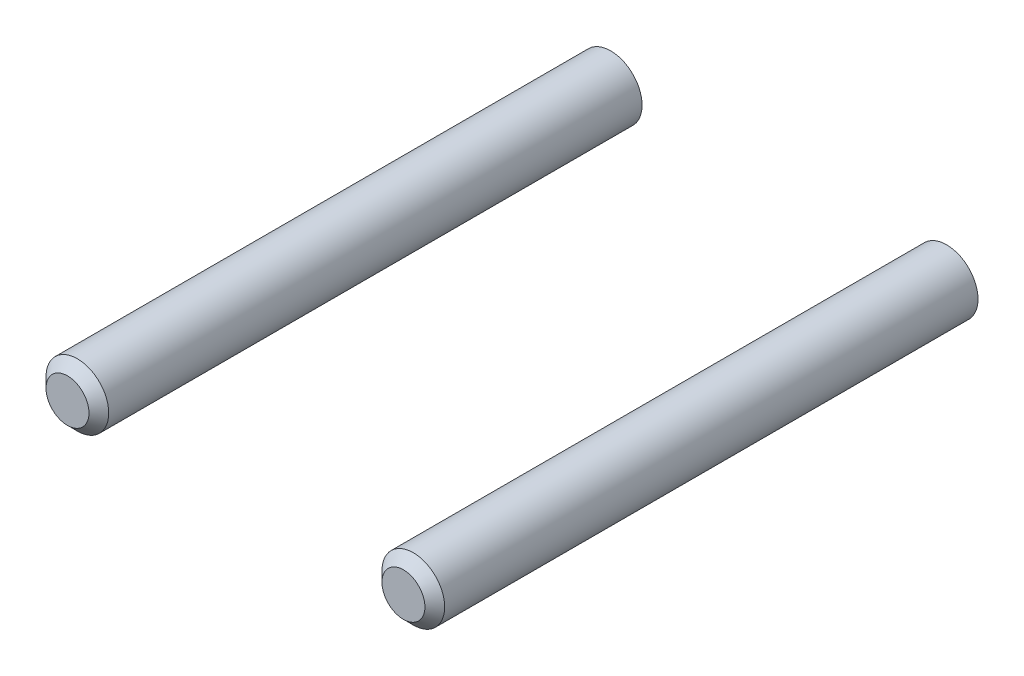
ISO-10303-21;
HEADER;
FILE_DESCRIPTION(('STEP AP214'),'2;1');
FILE_NAME('part.step','',(''),(''),'','','');
FILE_SCHEMA(('AUTOMOTIVE_DESIGN { 1 0 10303 214 1 1 1 1 }'));
ENDSEC;
DATA;
#1=APPLICATION_CONTEXT('core data for automotive mechanical design processes');
#2=APPLICATION_PROTOCOL_DEFINITION('international standard','automotive_design',2000,#1);
#3=PRODUCT_CONTEXT('',#1,'mechanical');
#4=PRODUCT('Part','Part','',(#3));
#5=PRODUCT_RELATED_PRODUCT_CATEGORY('part','',(#4));
#6=PRODUCT_DEFINITION_FORMATION('','',#4);
#7=PRODUCT_DEFINITION_CONTEXT('part definition',#1,'design');
#8=PRODUCT_DEFINITION('design','',#6,#7);
#9=PRODUCT_DEFINITION_SHAPE('','',#8);
#10=(LENGTH_UNIT() NAMED_UNIT(*) SI_UNIT(.MILLI.,.METRE.));
#11=(NAMED_UNIT(*) PLANE_ANGLE_UNIT() SI_UNIT($,.RADIAN.));
#12=(NAMED_UNIT(*) SI_UNIT($,.STERADIAN.) SOLID_ANGLE_UNIT());
#13=UNCERTAINTY_MEASURE_WITH_UNIT(LENGTH_MEASURE(1.E-05),#10,'distance_accuracy_value','');
#14=(GEOMETRIC_REPRESENTATION_CONTEXT(3) GLOBAL_UNCERTAINTY_ASSIGNED_CONTEXT((#13)) GLOBAL_UNIT_ASSIGNED_CONTEXT((#10,
#11,#12)) REPRESENTATION_CONTEXT('',''));
#15=CARTESIAN_POINT('',(0.,0.,0.));
#16=DIRECTION('',(0.,0.,1.));
#17=DIRECTION('',(1.,0.,0.));
#18=AXIS2_PLACEMENT_3D('',#15,#16,#17);
#19=CARTESIAN_POINT('',(36.5229699907981,36.9033953158821,-90.));
#20=DIRECTION('',(0.,0.,1.));
#21=DIRECTION('',(1.,0.,0.));
#22=AXIS2_PLACEMENT_3D('',#19,#20,#21);
#23=CYLINDRICAL_SURFACE('',#22,6.35);
#24=CARTESIAN_POINT('',(36.5229699907981,36.9033953158821,18.));
#25=DIRECTION('',(0.,0.,1.));
#26=DIRECTION('',(1.,0.,0.));
#27=AXIS2_PLACEMENT_3D('',#24,#25,#26);
#28=CIRCLE('',#27,6.35);
#29=CARTESIAN_POINT('',(42.8729699907981,36.9033953158821,18.));
#30=VERTEX_POINT('',#29);
#31=EDGE_CURVE('E11',#30,#30,#28,.F.);
#32=CARTESIAN_POINT('',(36.5229699907981,36.9033953158821,-90.));
#33=DIRECTION('',(0.,0.,1.));
#34=DIRECTION('',(1.,0.,0.));
#35=AXIS2_PLACEMENT_3D('',#32,#33,#34);
#36=CIRCLE('',#35,6.35);
#37=CARTESIAN_POINT('',(42.8729699907981,36.9033953158821,-90.));
#38=VERTEX_POINT('',#37);
#39=EDGE_CURVE('E50',#38,#38,#36,.T.);
#40=CARTESIAN_POINT('',(42.8729699907981,36.9033953158821,18.));
#41=CARTESIAN_POINT('',(42.8729699907981,36.9033953158821,16.875));
#42=CARTESIAN_POINT('',(42.8729699907981,36.9033953158821,15.75));
#43=CARTESIAN_POINT('',(42.8729699907981,36.9033953158821,13.5));
#44=CARTESIAN_POINT('',(42.8729699907981,36.9033953158821,12.375));
#45=CARTESIAN_POINT('',(42.8729699907981,36.9033953158821,10.125));
#46=CARTESIAN_POINT('',(42.8729699907981,36.9033953158821,9.00000000000002));
#47=CARTESIAN_POINT('',(42.8729699907981,36.9033953158821,6.75000000000002));
#48=CARTESIAN_POINT('',(42.8729699907981,36.9033953158821,5.62500000000002));
#49=CARTESIAN_POINT('',(42.8729699907981,36.9033953158821,3.37500000000002));
#50=CARTESIAN_POINT('',(42.8729699907981,36.9033953158821,2.25000000000003));
#51=CARTESIAN_POINT('',(42.8729699907981,36.9033953158821,0.));
#52=CARTESIAN_POINT('',(42.8729699907981,36.9033953158821,-1.12499999999998));
#53=CARTESIAN_POINT('',(42.8729699907981,36.9033953158821,-3.37499999999998));
#54=CARTESIAN_POINT('',(42.8729699907981,36.9033953158821,-4.49999999999998));
#55=CARTESIAN_POINT('',(42.8729699907981,36.9033953158821,-6.74999999999998));
#56=CARTESIAN_POINT('',(42.8729699907981,36.9033953158821,-7.87499999999998));
#57=CARTESIAN_POINT('',(42.8729699907981,36.9033953158821,-10.125));
#58=CARTESIAN_POINT('',(42.8729699907981,36.9033953158821,-11.25));
#59=CARTESIAN_POINT('',(42.8729699907981,36.9033953158821,-13.5));
#60=CARTESIAN_POINT('',(42.8729699907981,36.9033953158821,-14.625));
#61=CARTESIAN_POINT('',(42.8729699907981,36.9033953158821,-16.875));
#62=CARTESIAN_POINT('',(42.8729699907981,36.9033953158821,-18.));
#63=CARTESIAN_POINT('',(42.8729699907981,36.9033953158821,-20.25));
#64=CARTESIAN_POINT('',(42.8729699907981,36.9033953158821,-21.375));
#65=CARTESIAN_POINT('',(42.8729699907981,36.9033953158821,-23.625));
#66=CARTESIAN_POINT('',(42.8729699907981,36.9033953158821,-24.75));
#67=CARTESIAN_POINT('',(42.8729699907981,36.9033953158821,-27.));
#68=CARTESIAN_POINT('',(42.8729699907981,36.9033953158821,-28.125));
#69=CARTESIAN_POINT('',(42.8729699907981,36.9033953158821,-30.375));
#70=CARTESIAN_POINT('',(42.8729699907981,36.9033953158821,-31.5));
#71=CARTESIAN_POINT('',(42.8729699907981,36.9033953158821,-33.75));
#72=CARTESIAN_POINT('',(42.8729699907981,36.9033953158821,-34.875));
#73=CARTESIAN_POINT('',(42.8729699907981,36.9033953158821,-37.125));
#74=CARTESIAN_POINT('',(42.8729699907981,36.9033953158821,-38.25));
#75=CARTESIAN_POINT('',(42.8729699907981,36.9033953158821,-40.5));
#76=CARTESIAN_POINT('',(42.8729699907981,36.9033953158821,-41.625));
#77=CARTESIAN_POINT('',(42.8729699907981,36.9033953158821,-43.875));
#78=CARTESIAN_POINT('',(42.8729699907981,36.9033953158821,-45.));
#79=CARTESIAN_POINT('',(42.8729699907981,36.9033953158821,-47.25));
#80=CARTESIAN_POINT('',(42.8729699907981,36.9033953158821,-48.375));
#81=CARTESIAN_POINT('',(42.8729699907981,36.9033953158821,-50.625));
#82=CARTESIAN_POINT('',(42.8729699907981,36.9033953158821,-51.75));
#83=CARTESIAN_POINT('',(42.8729699907981,36.9033953158821,-54.));
#84=CARTESIAN_POINT('',(42.8729699907981,36.9033953158821,-55.125));
#85=CARTESIAN_POINT('',(42.8729699907981,36.9033953158821,-57.375));
#86=CARTESIAN_POINT('',(42.8729699907981,36.9033953158821,-58.5));
#87=CARTESIAN_POINT('',(42.8729699907981,36.9033953158821,-60.75));
#88=CARTESIAN_POINT('',(42.8729699907981,36.9033953158821,-61.875));
#89=CARTESIAN_POINT('',(42.8729699907981,36.9033953158821,-64.125));
#90=CARTESIAN_POINT('',(42.8729699907981,36.9033953158821,-65.25));
#91=CARTESIAN_POINT('',(42.8729699907981,36.9033953158821,-67.5));
#92=CARTESIAN_POINT('',(42.8729699907981,36.9033953158821,-68.625));
#93=CARTESIAN_POINT('',(42.8729699907981,36.9033953158821,-70.875));
#94=CARTESIAN_POINT('',(42.8729699907981,36.9033953158821,-72.));
#95=CARTESIAN_POINT('',(42.8729699907981,36.9033953158821,-74.25));
#96=CARTESIAN_POINT('',(42.8729699907981,36.9033953158821,-75.375));
#97=CARTESIAN_POINT('',(42.8729699907981,36.9033953158821,-77.625));
#98=CARTESIAN_POINT('',(42.8729699907981,36.9033953158821,-78.75));
#99=CARTESIAN_POINT('',(42.8729699907981,36.9033953158821,-81.));
#100=CARTESIAN_POINT('',(42.8729699907981,36.9033953158821,-82.125));
#101=CARTESIAN_POINT('',(42.8729699907981,36.9033953158821,-84.375));
#102=CARTESIAN_POINT('',(42.8729699907981,36.9033953158821,-85.5));
#103=CARTESIAN_POINT('',(42.8729699907981,36.9033953158821,-87.75));
#104=CARTESIAN_POINT('',(42.8729699907981,36.9033953158821,-88.875));
#105=CARTESIAN_POINT('',(42.8729699907981,36.9033953158821,-90.));
#106=B_SPLINE_CURVE_WITH_KNOTS('',3,(#40,#41,#42,#43,#44,#45,#46,#47,#48,#49,#50,#51,#52,#53,
#54,#55,#56,#57,#58,#59,#60,#61,#62,#63,#64,#65,#66,#67,#68,#69,#70,#71,#72,#73,#74,#75,#76,#77,
#78,#79,#80,#81,#82,#83,#84,#85,#86,#87,#88,#89,#90,#91,#92,#93,#94,#95,#96,#97,#98,#99,#100,
#101,#102,#103,#104,#105),.UNSPECIFIED.,.F.,.F.,(4,2,2,2,2,2,2,2,2,2,2,2,2,2,2,2,2,2,2,2,2,2,2,
2,2,2,2,2,2,2,2,2,4),(0.,3.375,6.75000000000001,10.125,13.5,16.875,20.25,23.625,27.,30.375,
33.75,37.125,40.5,43.875,47.25,50.625,54.,57.375,60.75,64.125,67.5,70.875,74.25,77.625,81.,
84.375,87.75,91.125,94.5,97.875,101.25,104.625,108.),.UNSPECIFIED.);
#107=EDGE_CURVE('BSEAM39',#30,#38,#106,.T.);
#108=ORIENTED_EDGE('',*,*,#31,.T.);
#109=ORIENTED_EDGE('',*,*,#39,.T.);
#110=ORIENTED_EDGE('',*,*,#107,.T.);
#111=ORIENTED_EDGE('',*,*,#107,.F.);
#112=EDGE_LOOP('',(#108,#110,#109,#111));
#113=FACE_BOUND('',#112,.T.);
#114=ADVANCED_FACE('F39',(#113),#23,.T.);
#115=CARTESIAN_POINT('',(36.5229699907981,36.9033953158821,-90.));
#116=DIRECTION('',(0.,0.,1.));
#117=DIRECTION('',(1.,0.,0.));
#118=AXIS2_PLACEMENT_3D('',#115,#116,#117);
#119=PLANE('',#118);
#120=ORIENTED_EDGE('',*,*,#39,.F.);
#121=EDGE_LOOP('',(#120));
#122=FACE_BOUND('',#121,.T.);
#123=ADVANCED_FACE('F58',(#122),#119,.F.);
#124=CARTESIAN_POINT('',(36.5229699907981,36.9033953158821,20.));
#125=DIRECTION('',(0.,0.,1.));
#126=DIRECTION('',(1.,0.,0.));
#127=AXIS2_PLACEMENT_3D('',#124,#125,#126);
#128=PLANE('',#127);
#129=CARTESIAN_POINT('',(36.5229699907981,36.9033953158821,20.));
#130=DIRECTION('',(0.,0.,1.));
#131=DIRECTION('',(1.,0.,0.));
#132=AXIS2_PLACEMENT_3D('',#129,#130,#131);
#133=CIRCLE('',#132,4.35000000000004);
#134=CARTESIAN_POINT('',(40.8729699907981,36.9033953158821,20.));
#135=VERTEX_POINT('',#134);
#136=EDGE_CURVE('E46',#135,#135,#133,.T.);
#137=ORIENTED_EDGE('',*,*,#136,.T.);
#138=EDGE_LOOP('',(#137));
#139=FACE_BOUND('',#138,.T.);
#140=ADVANCED_FACE('F60',(#139),#128,.T.);
#141=CARTESIAN_POINT('',(36.5229699907981,36.9033953158821,20.));
#142=DIRECTION('',(0.,0.,-1.));
#143=DIRECTION('',(-1.,0.,0.));
#144=AXIS2_PLACEMENT_3D('',#141,#142,#143);
#145=CONICAL_SURFACE('',#144,4.35000000000003,0.78539816339745);
#146=ORIENTED_EDGE('',*,*,#31,.F.);
#147=EDGE_LOOP('',(#146));
#148=FACE_BOUND('',#147,.T.);
#149=ORIENTED_EDGE('',*,*,#136,.F.);
#150=EDGE_LOOP('',(#149));
#151=FACE_BOUND('',#150,.T.);
#152=ADVANCED_FACE('F41',(#148,#151),#145,.T.);
#153=CLOSED_SHELL('',(#114,#123,#140,#152));
#154=MANIFOLD_SOLID_BREP('B2',#153);
#155=CARTESIAN_POINT('',(-31.5064672607248,36.9033953158821,-90.));
#156=DIRECTION('',(0.,0.,1.));
#157=DIRECTION('',(1.,0.,0.));
#158=AXIS2_PLACEMENT_3D('',#155,#156,#157);
#159=CYLINDRICAL_SURFACE('',#158,6.35);
#160=CARTESIAN_POINT('',(-31.5064672607248,36.9033953158821,18.));
#161=DIRECTION('',(0.,0.,1.));
#162=DIRECTION('',(1.,0.,0.));
#163=AXIS2_PLACEMENT_3D('',#160,#161,#162);
#164=CIRCLE('',#163,6.35);
#165=CARTESIAN_POINT('',(-25.1564672607248,36.9033953158821,18.));
#166=VERTEX_POINT('',#165);
#167=EDGE_CURVE('E38',#166,#166,#164,.F.);
#168=CARTESIAN_POINT('',(-31.5064672607248,36.9033953158821,-90.));
#169=DIRECTION('',(0.,0.,1.));
#170=DIRECTION('',(1.,0.,0.));
#171=AXIS2_PLACEMENT_3D('',#168,#169,#170);
#172=CIRCLE('',#171,6.35);
#173=CARTESIAN_POINT('',(-25.1564672607248,36.9033953158821,-90.));
#174=VERTEX_POINT('',#173);
#175=EDGE_CURVE('E106',#174,#174,#172,.T.);
#176=CARTESIAN_POINT('',(-25.1564672607248,36.9033953158821,18.));
#177=CARTESIAN_POINT('',(-25.1564672607248,36.9033953158821,16.875));
#178=CARTESIAN_POINT('',(-25.1564672607248,36.9033953158821,15.75));
#179=CARTESIAN_POINT('',(-25.1564672607248,36.9033953158821,13.5));
#180=CARTESIAN_POINT('',(-25.1564672607248,36.9033953158821,12.375));
#181=CARTESIAN_POINT('',(-25.1564672607248,36.9033953158821,10.125));
#182=CARTESIAN_POINT('',(-25.1564672607248,36.9033953158821,9.));
#183=CARTESIAN_POINT('',(-25.1564672607248,36.9033953158821,6.75000000000001));
#184=CARTESIAN_POINT('',(-25.1564672607248,36.9033953158821,5.62500000000001));
#185=CARTESIAN_POINT('',(-25.1564672607248,36.9033953158821,3.375));
#186=CARTESIAN_POINT('',(-25.1564672607248,36.9033953158821,2.25));
#187=CARTESIAN_POINT('',(-25.1564672607248,36.9033953158821,0.));
#188=CARTESIAN_POINT('',(-25.1564672607248,36.9033953158821,-1.125));
#189=CARTESIAN_POINT('',(-25.1564672607248,36.9033953158821,-3.375));
#190=CARTESIAN_POINT('',(-25.1564672607248,36.9033953158821,-4.5));
#191=CARTESIAN_POINT('',(-25.1564672607248,36.9033953158821,-6.75000000000001));
#192=CARTESIAN_POINT('',(-25.1564672607248,36.9033953158821,-7.87500000000001));
#193=CARTESIAN_POINT('',(-25.1564672607248,36.9033953158821,-10.125));
#194=CARTESIAN_POINT('',(-25.1564672607248,36.9033953158821,-11.25));
#195=CARTESIAN_POINT('',(-25.1564672607248,36.9033953158821,-13.5));
#196=CARTESIAN_POINT('',(-25.1564672607248,36.9033953158821,-14.625));
#197=CARTESIAN_POINT('',(-25.1564672607248,36.9033953158821,-16.875));
#198=CARTESIAN_POINT('',(-25.1564672607248,36.9033953158821,-18.));
#199=CARTESIAN_POINT('',(-25.1564672607248,36.9033953158821,-20.25));
#200=CARTESIAN_POINT('',(-25.1564672607248,36.9033953158821,-21.375));
#201=CARTESIAN_POINT('',(-25.1564672607248,36.9033953158821,-23.625));
#202=CARTESIAN_POINT('',(-25.1564672607248,36.9033953158821,-24.75));
#203=CARTESIAN_POINT('',(-25.1564672607248,36.9033953158821,-27.));
#204=CARTESIAN_POINT('',(-25.1564672607248,36.9033953158821,-28.125));
#205=CARTESIAN_POINT('',(-25.1564672607248,36.9033953158821,-30.375));
#206=CARTESIAN_POINT('',(-25.1564672607248,36.9033953158821,-31.5));
#207=CARTESIAN_POINT('',(-25.1564672607248,36.9033953158821,-33.75));
#208=CARTESIAN_POINT('',(-25.1564672607248,36.9033953158821,-34.875));
#209=CARTESIAN_POINT('',(-25.1564672607248,36.9033953158821,-37.125));
#210=CARTESIAN_POINT('',(-25.1564672607248,36.9033953158821,-38.25));
#211=CARTESIAN_POINT('',(-25.1564672607248,36.9033953158821,-40.5));
#212=CARTESIAN_POINT('',(-25.1564672607248,36.9033953158821,-41.625));
#213=CARTESIAN_POINT('',(-25.1564672607248,36.9033953158821,-43.875));
#214=CARTESIAN_POINT('',(-25.1564672607248,36.9033953158821,-45.));
#215=CARTESIAN_POINT('',(-25.1564672607248,36.9033953158821,-47.25));
#216=CARTESIAN_POINT('',(-25.1564672607248,36.9033953158821,-48.375));
#217=CARTESIAN_POINT('',(-25.1564672607248,36.9033953158821,-50.625));
#218=CARTESIAN_POINT('',(-25.1564672607248,36.9033953158821,-51.75));
#219=CARTESIAN_POINT('',(-25.1564672607248,36.9033953158821,-54.));
#220=CARTESIAN_POINT('',(-25.1564672607248,36.9033953158821,-55.125));
#221=CARTESIAN_POINT('',(-25.1564672607248,36.9033953158821,-57.375));
#222=CARTESIAN_POINT('',(-25.1564672607248,36.9033953158821,-58.5));
#223=CARTESIAN_POINT('',(-25.1564672607248,36.9033953158821,-60.75));
#224=CARTESIAN_POINT('',(-25.1564672607248,36.9033953158821,-61.875));
#225=CARTESIAN_POINT('',(-25.1564672607248,36.9033953158821,-64.125));
#226=CARTESIAN_POINT('',(-25.1564672607248,36.9033953158821,-65.25));
#227=CARTESIAN_POINT('',(-25.1564672607248,36.9033953158821,-67.5));
#228=CARTESIAN_POINT('',(-25.1564672607248,36.9033953158821,-68.625));
#229=CARTESIAN_POINT('',(-25.1564672607248,36.9033953158821,-70.875));
#230=CARTESIAN_POINT('',(-25.1564672607248,36.9033953158821,-72.));
#231=CARTESIAN_POINT('',(-25.1564672607248,36.9033953158821,-74.25));
#232=CARTESIAN_POINT('',(-25.1564672607248,36.9033953158821,-75.375));
#233=CARTESIAN_POINT('',(-25.1564672607248,36.9033953158821,-77.625));
#234=CARTESIAN_POINT('',(-25.1564672607248,36.9033953158821,-78.75));
#235=CARTESIAN_POINT('',(-25.1564672607248,36.9033953158821,-81.));
#236=CARTESIAN_POINT('',(-25.1564672607248,36.9033953158821,-82.125));
#237=CARTESIAN_POINT('',(-25.1564672607248,36.9033953158821,-84.375));
#238=CARTESIAN_POINT('',(-25.1564672607248,36.9033953158821,-85.5));
#239=CARTESIAN_POINT('',(-25.1564672607248,36.9033953158821,-87.75));
#240=CARTESIAN_POINT('',(-25.1564672607248,36.9033953158821,-88.875));
#241=CARTESIAN_POINT('',(-25.1564672607248,36.9033953158821,-90.));
#242=B_SPLINE_CURVE_WITH_KNOTS('',3,(#176,#177,#178,#179,#180,#181,#182,#183,#184,#185,#186,
#187,#188,#189,#190,#191,#192,#193,#194,#195,#196,#197,#198,#199,#200,#201,#202,#203,#204,#205,
#206,#207,#208,#209,#210,#211,#212,#213,#214,#215,#216,#217,#218,#219,#220,#221,#222,#223,#224,
#225,#226,#227,#228,#229,#230,#231,#232,#233,#234,#235,#236,#237,#238,#239,#240,#241),
.UNSPECIFIED.,.F.,.F.,(4,2,2,2,2,2,2,2,2,2,2,2,2,2,2,2,2,2,2,2,2,2,2,2,2,2,2,2,2,2,2,2,4),(0.,
3.375,6.75000000000001,10.125,13.5,16.875,20.25,23.625,27.,30.375,33.75,37.125,40.5,43.875,
47.25,50.625,54.,57.375,60.75,64.125,67.5,70.875,74.25,77.625,81.,84.375,87.75,91.125,94.5,
97.875,101.25,104.625,108.),.UNSPECIFIED.);
#243=EDGE_CURVE('BSEAM95',#166,#174,#242,.T.);
#244=ORIENTED_EDGE('',*,*,#167,.T.);
#245=ORIENTED_EDGE('',*,*,#175,.T.);
#246=ORIENTED_EDGE('',*,*,#243,.T.);
#247=ORIENTED_EDGE('',*,*,#243,.F.);
#248=EDGE_LOOP('',(#244,#246,#245,#247));
#249=FACE_BOUND('',#248,.T.);
#250=ADVANCED_FACE('F95',(#249),#159,.T.);
#251=CARTESIAN_POINT('',(-31.5064672607248,36.9033953158821,-90.));
#252=DIRECTION('',(0.,0.,1.));
#253=DIRECTION('',(1.,0.,0.));
#254=AXIS2_PLACEMENT_3D('',#251,#252,#253);
#255=PLANE('',#254);
#256=ORIENTED_EDGE('',*,*,#175,.F.);
#257=EDGE_LOOP('',(#256));
#258=FACE_BOUND('',#257,.T.);
#259=ADVANCED_FACE('F114',(#258),#255,.F.);
#260=CARTESIAN_POINT('',(-31.5064672607248,36.9033953158821,20.));
#261=DIRECTION('',(0.,0.,1.));
#262=DIRECTION('',(1.,0.,0.));
#263=AXIS2_PLACEMENT_3D('',#260,#261,#262);
#264=PLANE('',#263);
#265=CARTESIAN_POINT('',(-31.5064672607248,36.9033953158821,20.));
#266=DIRECTION('',(0.,0.,1.));
#267=DIRECTION('',(1.,0.,0.));
#268=AXIS2_PLACEMENT_3D('',#265,#266,#267);
#269=CIRCLE('',#268,4.35000000000001);
#270=CARTESIAN_POINT('',(-27.1564672607248,36.9033953158821,20.));
#271=VERTEX_POINT('',#270);
#272=EDGE_CURVE('E102',#271,#271,#269,.T.);
#273=ORIENTED_EDGE('',*,*,#272,.T.);
#274=EDGE_LOOP('',(#273));
#275=FACE_BOUND('',#274,.T.);
#276=ADVANCED_FACE('F116',(#275),#264,.T.);
#277=CARTESIAN_POINT('',(-31.5064672607248,36.9033953158821,20.));
#278=DIRECTION('',(0.,0.,-1.));
#279=DIRECTION('',(-1.,0.,0.));
#280=AXIS2_PLACEMENT_3D('',#277,#278,#279);
#281=CONICAL_SURFACE('',#280,4.35000000000001,0.78539816339745);
#282=ORIENTED_EDGE('',*,*,#167,.F.);
#283=EDGE_LOOP('',(#282));
#284=FACE_BOUND('',#283,.T.);
#285=ORIENTED_EDGE('',*,*,#272,.F.);
#286=EDGE_LOOP('',(#285));
#287=FACE_BOUND('',#286,.T.);
#288=ADVANCED_FACE('F97',(#284,#287),#281,.T.);
#289=CLOSED_SHELL('',(#250,#259,#276,#288));
#290=MANIFOLD_SOLID_BREP('B6',#289);
#291=ADVANCED_BREP_SHAPE_REPRESENTATION('',(#18,#154,#290),#14);
#292=SHAPE_DEFINITION_REPRESENTATION(#9,#291);
ENDSEC;
END-ISO-10303-21;
